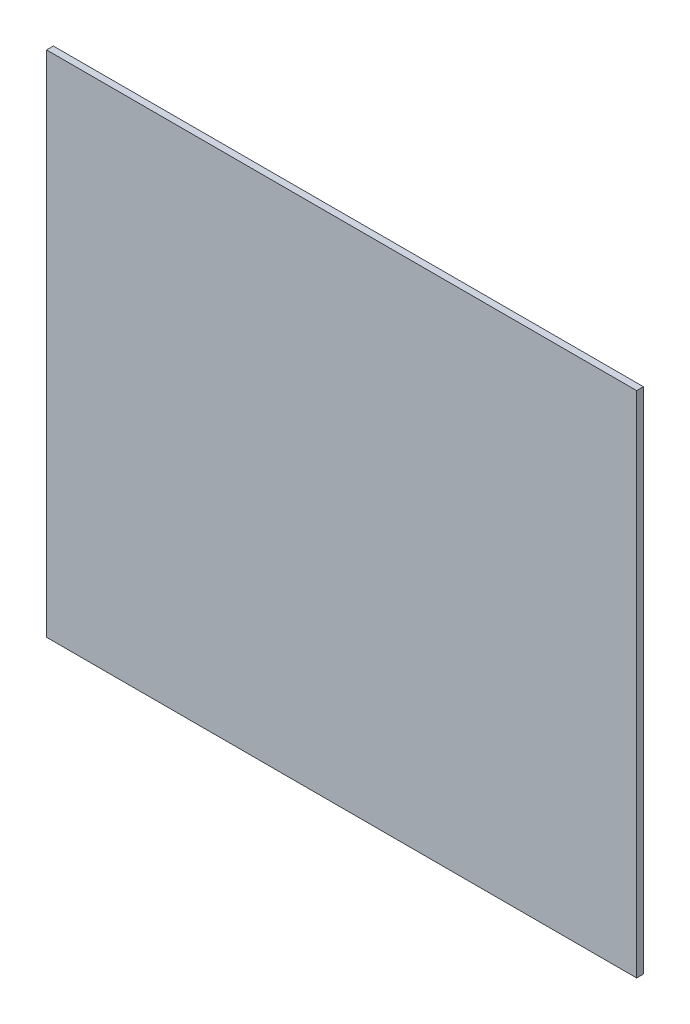
ISO-10303-21;
HEADER;
FILE_DESCRIPTION(('STEP AP214'),'2;1');
FILE_NAME('part.step','',(''),(''),'','','');
FILE_SCHEMA(('AUTOMOTIVE_DESIGN { 1 0 10303 214 1 1 1 1 }'));
ENDSEC;
DATA;
#1=APPLICATION_CONTEXT('core data for automotive mechanical design processes');
#2=APPLICATION_PROTOCOL_DEFINITION('international standard','automotive_design',2000,#1);
#3=PRODUCT_CONTEXT('',#1,'mechanical');
#4=PRODUCT('Part','Part','',(#3));
#5=PRODUCT_RELATED_PRODUCT_CATEGORY('part','',(#4));
#6=PRODUCT_DEFINITION_FORMATION('','',#4);
#7=PRODUCT_DEFINITION_CONTEXT('part definition',#1,'design');
#8=PRODUCT_DEFINITION('design','',#6,#7);
#9=PRODUCT_DEFINITION_SHAPE('','',#8);
#10=(LENGTH_UNIT() NAMED_UNIT(*) SI_UNIT(.MILLI.,.METRE.));
#11=(NAMED_UNIT(*) PLANE_ANGLE_UNIT() SI_UNIT($,.RADIAN.));
#12=(NAMED_UNIT(*) SI_UNIT($,.STERADIAN.) SOLID_ANGLE_UNIT());
#13=UNCERTAINTY_MEASURE_WITH_UNIT(LENGTH_MEASURE(1.E-05),#10,'distance_accuracy_value','');
#14=(GEOMETRIC_REPRESENTATION_CONTEXT(3) GLOBAL_UNCERTAINTY_ASSIGNED_CONTEXT((#13)) GLOBAL_UNIT_ASSIGNED_CONTEXT((#10,
#11,#12)) REPRESENTATION_CONTEXT('',''));
#15=CARTESIAN_POINT('',(0.,0.,0.));
#16=DIRECTION('',(0.,0.,1.));
#17=DIRECTION('',(1.,0.,0.));
#18=AXIS2_PLACEMENT_3D('',#15,#16,#17);
#19=CARTESIAN_POINT('',(-33.1728311921536,31.2834645669291,0.999999999999998));
#20=DIRECTION('',(1.,0.,0.));
#21=DIRECTION('',(0.,1.,0.));
#22=AXIS2_PLACEMENT_3D('',#19,#20,#21);
#23=PLANE('',#22);
#24=DIRECTION('',(0.,-1.,0.));
#25=VECTOR('',#24,1.);
#26=CARTESIAN_POINT('',(-33.1728311921536,31.2834645669291,0.));
#27=LINE('',#26,#25);
#28=CARTESIAN_POINT('',(-33.1728311921536,31.2834645669291,0.));
#29=VERTEX_POINT('',#28);
#30=CARTESIAN_POINT('',(-33.1728311921536,3.78346456692913,0.));
#31=VERTEX_POINT('',#30);
#32=EDGE_CURVE('E162',#29,#31,#27,.T.);
#33=ORIENTED_EDGE('',*,*,#32,.T.);
#34=DIRECTION('',(0.,0.,-1.));
#35=VECTOR('',#34,1.);
#36=CARTESIAN_POINT('',(-33.1728311921536,3.78346456692913,0.999999999999998));
#37=LINE('',#36,#35);
#38=CARTESIAN_POINT('',(-33.1728311921536,3.78346456692913,-9.));
#39=VERTEX_POINT('',#38);
#40=EDGE_CURVE('E141',#31,#39,#37,.T.);
#41=ORIENTED_EDGE('',*,*,#40,.T.);
#42=DIRECTION('',(0.,-1.,0.));
#43=VECTOR('',#42,1.);
#44=CARTESIAN_POINT('',(-33.1728311921536,3.78346456692913,-9.));
#45=LINE('',#44,#43);
#46=CARTESIAN_POINT('',(-33.1728311921536,-16.2165354330709,-9.));
#47=VERTEX_POINT('',#46);
#48=EDGE_CURVE('E129',#39,#47,#45,.T.);
#49=ORIENTED_EDGE('',*,*,#48,.T.);
#50=DIRECTION('',(0.,0.,1.));
#51=VECTOR('',#50,1.);
#52=CARTESIAN_POINT('',(-33.1728311921536,-16.2165354330709,1.));
#53=LINE('',#52,#51);
#54=CARTESIAN_POINT('',(-33.1728311921536,-16.2165354330709,0.));
#55=VERTEX_POINT('',#54);
#56=EDGE_CURVE('E54',#47,#55,#53,.T.);
#57=ORIENTED_EDGE('',*,*,#56,.T.);
#58=CARTESIAN_POINT('',(-33.1728311921536,-43.7165354330709,0.));
#59=VERTEX_POINT('',#58);
#60=EDGE_CURVE('E149',#55,#59,#27,.T.);
#61=ORIENTED_EDGE('',*,*,#60,.T.);
#62=DIRECTION('',(0.,0.,-1.));
#63=VECTOR('',#62,1.);
#64=CARTESIAN_POINT('',(-33.1728311921536,-43.7165354330709,0.999999999999998));
#65=LINE('',#64,#63);
#66=CARTESIAN_POINT('',(-33.1728311921536,-43.7165354330709,0.999999999999998));
#67=VERTEX_POINT('',#66);
#68=EDGE_CURVE('E183',#67,#59,#65,.T.);
#69=ORIENTED_EDGE('',*,*,#68,.F.);
#70=DIRECTION('',(0.,-1.,0.));
#71=VECTOR('',#70,1.);
#72=CARTESIAN_POINT('',(-33.1728311921536,31.2834645669291,0.999999999999998));
#73=LINE('',#72,#71);
#74=CARTESIAN_POINT('',(-33.1728311921536,31.2834645669291,0.999999999999998));
#75=VERTEX_POINT('',#74);
#76=EDGE_CURVE('E88',#75,#67,#73,.T.);
#77=ORIENTED_EDGE('',*,*,#76,.F.);
#78=DIRECTION('',(0.,0.,-1.));
#79=VECTOR('',#78,1.);
#80=CARTESIAN_POINT('',(-33.1728311921536,31.2834645669291,0.999999999999998));
#81=LINE('',#80,#79);
#82=EDGE_CURVE('E161',#75,#29,#81,.T.);
#83=ORIENTED_EDGE('',*,*,#82,.T.);
#84=EDGE_LOOP('',(#33,#41,#49,#57,#61,#69,#77,#83));
#85=FACE_BOUND('',#84,.T.);
#86=ADVANCED_FACE('F39',(#85),#23,.F.);
#87=CARTESIAN_POINT('',(-33.1728311921536,-43.7165354330709,0.999999999999998));
#88=DIRECTION('',(0.,1.,0.));
#89=DIRECTION('',(0.,0.,1.));
#90=AXIS2_PLACEMENT_3D('',#87,#88,#89);
#91=PLANE('',#90);
#92=DIRECTION('',(1.,0.,0.));
#93=VECTOR('',#92,1.);
#94=CARTESIAN_POINT('',(-33.1728311921536,-43.7165354330709,0.));
#95=LINE('',#94,#93);
#96=CARTESIAN_POINT('',(53.8271688078464,-43.7165354330709,0.));
#97=VERTEX_POINT('',#96);
#98=EDGE_CURVE('E166',#59,#97,#95,.T.);
#99=ORIENTED_EDGE('',*,*,#98,.T.);
#100=DIRECTION('',(0.,0.,-1.));
#101=VECTOR('',#100,1.);
#102=CARTESIAN_POINT('',(53.8271688078464,-43.7165354330709,0.999999999999998));
#103=LINE('',#102,#101);
#104=CARTESIAN_POINT('',(53.8271688078464,-43.7165354330709,0.999999999999998));
#105=VERTEX_POINT('',#104);
#106=EDGE_CURVE('E179',#105,#97,#103,.T.);
#107=ORIENTED_EDGE('',*,*,#106,.F.);
#108=DIRECTION('',(1.,0.,0.));
#109=VECTOR('',#108,1.);
#110=CARTESIAN_POINT('',(-33.1728311921536,-43.7165354330709,0.999999999999998));
#111=LINE('',#110,#109);
#112=EDGE_CURVE('E153',#67,#105,#111,.T.);
#113=ORIENTED_EDGE('',*,*,#112,.F.);
#114=ORIENTED_EDGE('',*,*,#68,.T.);
#115=EDGE_LOOP('',(#99,#107,#113,#114));
#116=FACE_BOUND('',#115,.T.);
#117=ADVANCED_FACE('F204',(#116),#91,.F.);
#118=CARTESIAN_POINT('',(53.8271688078464,31.2834645669291,0.999999999999998));
#119=DIRECTION('',(-1.,0.,0.));
#120=DIRECTION('',(0.,-1.,0.));
#121=AXIS2_PLACEMENT_3D('',#118,#119,#120);
#122=PLANE('',#121);
#123=DIRECTION('',(0.,1.,0.));
#124=VECTOR('',#123,1.);
#125=CARTESIAN_POINT('',(53.8271688078464,31.2834645669291,0.));
#126=LINE('',#125,#124);
#127=CARTESIAN_POINT('',(53.8271688078464,31.2834645669291,0.));
#128=VERTEX_POINT('',#127);
#129=EDGE_CURVE('E169',#97,#128,#126,.T.);
#130=ORIENTED_EDGE('',*,*,#129,.T.);
#131=DIRECTION('',(0.,0.,-1.));
#132=VECTOR('',#131,1.);
#133=CARTESIAN_POINT('',(53.8271688078464,31.2834645669291,0.999999999999998));
#134=LINE('',#133,#132);
#135=CARTESIAN_POINT('',(53.8271688078464,31.2834645669291,0.999999999999998));
#136=VERTEX_POINT('',#135);
#137=EDGE_CURVE('E176',#136,#128,#134,.T.);
#138=ORIENTED_EDGE('',*,*,#137,.F.);
#139=DIRECTION('',(0.,1.,0.));
#140=VECTOR('',#139,1.);
#141=CARTESIAN_POINT('',(53.8271688078464,31.2834645669291,0.999999999999998));
#142=LINE('',#141,#140);
#143=EDGE_CURVE('E156',#105,#136,#142,.T.);
#144=ORIENTED_EDGE('',*,*,#143,.F.);
#145=ORIENTED_EDGE('',*,*,#106,.T.);
#146=EDGE_LOOP('',(#130,#138,#144,#145));
#147=FACE_BOUND('',#146,.T.);
#148=ADVANCED_FACE('F201',(#147),#122,.F.);
#149=CARTESIAN_POINT('',(-33.1728311921536,31.2834645669291,0.999999999999998));
#150=DIRECTION('',(0.,-1.,0.));
#151=DIRECTION('',(0.,0.,-1.));
#152=AXIS2_PLACEMENT_3D('',#149,#150,#151);
#153=PLANE('',#152);
#154=DIRECTION('',(-1.,0.,0.));
#155=VECTOR('',#154,1.);
#156=CARTESIAN_POINT('',(-33.1728311921536,31.2834645669291,0.));
#157=LINE('',#156,#155);
#158=EDGE_CURVE('E83',#128,#29,#157,.T.);
#159=ORIENTED_EDGE('',*,*,#158,.T.);
#160=ORIENTED_EDGE('',*,*,#82,.F.);
#161=DIRECTION('',(-1.,0.,0.));
#162=VECTOR('',#161,1.);
#163=CARTESIAN_POINT('',(-33.1728311921536,31.2834645669291,0.999999999999998));
#164=LINE('',#163,#162);
#165=EDGE_CURVE('E63',#136,#75,#164,.T.);
#166=ORIENTED_EDGE('',*,*,#165,.F.);
#167=ORIENTED_EDGE('',*,*,#137,.T.);
#168=EDGE_LOOP('',(#159,#160,#166,#167));
#169=FACE_BOUND('',#168,.T.);
#170=ADVANCED_FACE('F195',(#169),#153,.F.);
#171=CARTESIAN_POINT('',(0.,0.,0.999999999999998));
#172=DIRECTION('',(0.,0.,1.));
#173=DIRECTION('',(1.,0.,0.));
#174=AXIS2_PLACEMENT_3D('',#171,#172,#173);
#175=PLANE('',#174);
#176=ORIENTED_EDGE('',*,*,#76,.T.);
#177=ORIENTED_EDGE('',*,*,#112,.T.);
#178=ORIENTED_EDGE('',*,*,#143,.T.);
#179=ORIENTED_EDGE('',*,*,#165,.T.);
#180=EDGE_LOOP('',(#176,#177,#178,#179));
#181=FACE_BOUND('',#180,.T.);
#182=ADVANCED_FACE('F215',(#181),#175,.T.);
#183=CARTESIAN_POINT('',(0.,0.,0.));
#184=DIRECTION('',(0.,0.,1.));
#185=DIRECTION('',(1.,0.,0.));
#186=AXIS2_PLACEMENT_3D('',#183,#184,#185);
#187=PLANE('',#186);
#188=ORIENTED_EDGE('',*,*,#60,.F.);
#189=DIRECTION('',(1.,0.,0.));
#190=VECTOR('',#189,1.);
#191=CARTESIAN_POINT('',(0.,-16.2165354330709,0.));
#192=LINE('',#191,#190);
#193=CARTESIAN_POINT('',(-28.1728311921536,-16.2165354330709,0.));
#194=VERTEX_POINT('',#193);
#195=EDGE_CURVE('E11',#55,#194,#192,.T.);
#196=ORIENTED_EDGE('',*,*,#195,.T.);
#197=DIRECTION('',(0.,1.,0.));
#198=VECTOR('',#197,1.);
#199=CARTESIAN_POINT('',(-28.1728311921536,0.,0.));
#200=LINE('',#199,#198);
#201=CARTESIAN_POINT('',(-28.1728311921536,3.78346456692913,0.));
#202=VERTEX_POINT('',#201);
#203=EDGE_CURVE('E187',#194,#202,#200,.T.);
#204=ORIENTED_EDGE('',*,*,#203,.T.);
#205=DIRECTION('',(-1.,0.,0.));
#206=VECTOR('',#205,1.);
#207=CARTESIAN_POINT('',(0.,3.78346456692913,0.));
#208=LINE('',#207,#206);
#209=EDGE_CURVE('E47',#202,#31,#208,.T.);
#210=ORIENTED_EDGE('',*,*,#209,.T.);
#211=ORIENTED_EDGE('',*,*,#32,.F.);
#212=ORIENTED_EDGE('',*,*,#158,.F.);
#213=ORIENTED_EDGE('',*,*,#129,.F.);
#214=ORIENTED_EDGE('',*,*,#98,.F.);
#215=EDGE_LOOP('',(#188,#196,#204,#210,#211,#212,#213,#214));
#216=FACE_BOUND('',#215,.T.);
#217=ADVANCED_FACE('F193',(#216),#187,.F.);
#218=CARTESIAN_POINT('',(-28.1728311921536,-16.2165354330709,1.));
#219=DIRECTION('',(0.,-1.,0.));
#220=DIRECTION('',(1.,0.,0.));
#221=AXIS2_PLACEMENT_3D('',#218,#219,#220);
#222=PLANE('',#221);
#223=ORIENTED_EDGE('',*,*,#195,.F.);
#224=ORIENTED_EDGE('',*,*,#56,.F.);
#225=DIRECTION('',(-1.,0.,0.));
#226=VECTOR('',#225,1.);
#227=CARTESIAN_POINT('',(-28.1728311921536,-16.2165354330709,-9.));
#228=LINE('',#227,#226);
#229=CARTESIAN_POINT('',(-28.1728311921536,-16.2165354330709,-9.));
#230=VERTEX_POINT('',#229);
#231=EDGE_CURVE('E131',#230,#47,#228,.T.);
#232=ORIENTED_EDGE('',*,*,#231,.F.);
#233=DIRECTION('',(0.,0.,1.));
#234=VECTOR('',#233,1.);
#235=CARTESIAN_POINT('',(-28.1728311921536,-16.2165354330709,1.));
#236=LINE('',#235,#234);
#237=EDGE_CURVE('E132',#230,#194,#236,.T.);
#238=ORIENTED_EDGE('',*,*,#237,.T.);
#239=EDGE_LOOP('',(#223,#224,#232,#238));
#240=FACE_BOUND('',#239,.T.);
#241=ADVANCED_FACE('F207',(#240),#222,.T.);
#242=CARTESIAN_POINT('',(-28.1728311921536,3.78346456692913,0.999999999999998));
#243=DIRECTION('',(0.,1.,0.));
#244=DIRECTION('',(0.,0.,1.));
#245=AXIS2_PLACEMENT_3D('',#242,#243,#244);
#246=PLANE('',#245);
#247=ORIENTED_EDGE('',*,*,#209,.F.);
#248=DIRECTION('',(0.,0.,-1.));
#249=VECTOR('',#248,1.);
#250=CARTESIAN_POINT('',(-28.1728311921536,3.78346456692913,0.999999999999998));
#251=LINE('',#250,#249);
#252=CARTESIAN_POINT('',(-28.1728311921536,3.78346456692913,-9.));
#253=VERTEX_POINT('',#252);
#254=EDGE_CURVE('E113',#202,#253,#251,.T.);
#255=ORIENTED_EDGE('',*,*,#254,.T.);
#256=DIRECTION('',(-1.,0.,0.));
#257=VECTOR('',#256,1.);
#258=CARTESIAN_POINT('',(-28.1728311921536,3.78346456692913,-9.));
#259=LINE('',#258,#257);
#260=EDGE_CURVE('E116',#253,#39,#259,.T.);
#261=ORIENTED_EDGE('',*,*,#260,.T.);
#262=ORIENTED_EDGE('',*,*,#40,.F.);
#263=EDGE_LOOP('',(#247,#255,#261,#262));
#264=FACE_BOUND('',#263,.T.);
#265=ADVANCED_FACE('F115',(#264),#246,.T.);
#266=CARTESIAN_POINT('',(-28.1728311921536,0.,0.));
#267=DIRECTION('',(1.,0.,0.));
#268=DIRECTION('',(0.,0.,-1.));
#269=AXIS2_PLACEMENT_3D('',#266,#267,#268);
#270=PLANE('',#269);
#271=ORIENTED_EDGE('',*,*,#203,.F.);
#272=ORIENTED_EDGE('',*,*,#237,.F.);
#273=DIRECTION('',(0.,-1.,0.));
#274=VECTOR('',#273,1.);
#275=CARTESIAN_POINT('',(-28.1728311921536,3.78346456692913,-9.));
#276=LINE('',#275,#274);
#277=EDGE_CURVE('E123',#253,#230,#276,.T.);
#278=ORIENTED_EDGE('',*,*,#277,.F.);
#279=ORIENTED_EDGE('',*,*,#254,.F.);
#280=EDGE_LOOP('',(#271,#272,#278,#279));
#281=FACE_BOUND('',#280,.T.);
#282=ADVANCED_FACE('F134',(#281),#270,.T.);
#283=CARTESIAN_POINT('',(-28.1728311921536,3.78346456692913,-9.));
#284=DIRECTION('',(0.,0.,-1.));
#285=DIRECTION('',(0.,1.,0.));
#286=AXIS2_PLACEMENT_3D('',#283,#284,#285);
#287=PLANE('',#286);
#288=ORIENTED_EDGE('',*,*,#48,.F.);
#289=ORIENTED_EDGE('',*,*,#260,.F.);
#290=ORIENTED_EDGE('',*,*,#277,.T.);
#291=ORIENTED_EDGE('',*,*,#231,.T.);
#292=EDGE_LOOP('',(#288,#289,#290,#291));
#293=FACE_BOUND('',#292,.T.);
#294=ADVANCED_FACE('F127',(#293),#287,.T.);
#295=CLOSED_SHELL('',(#86,#117,#148,#170,#182,#217,#241,#265,#282,#294));
#296=MANIFOLD_SOLID_BREP('B2',#295);
#297=ADVANCED_BREP_SHAPE_REPRESENTATION('',(#18,#296),#14);
#298=SHAPE_DEFINITION_REPRESENTATION(#9,#297);
ENDSEC;
END-ISO-10303-21;
